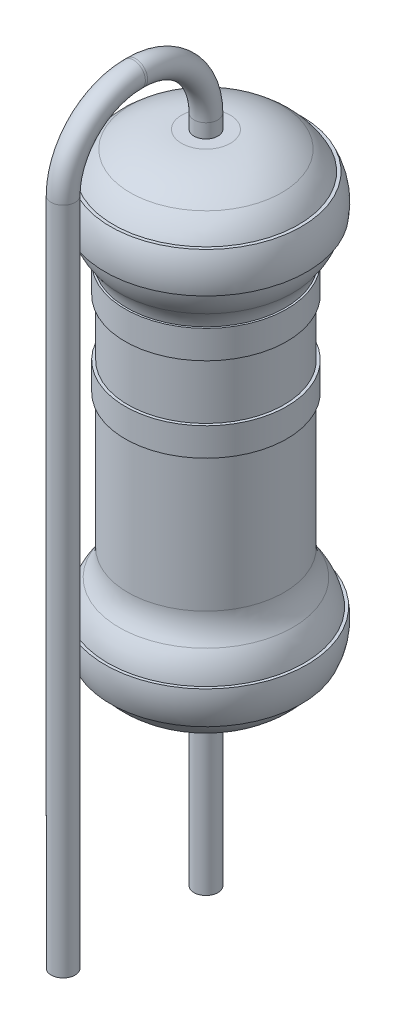
ISO-10303-21;
HEADER;
FILE_DESCRIPTION(('STEP AP214'),'2;1');
FILE_NAME('part.step','',(''),(''),'','','');
FILE_SCHEMA(('AUTOMOTIVE_DESIGN { 1 0 10303 214 1 1 1 1 }'));
ENDSEC;
DATA;
#1=APPLICATION_CONTEXT('core data for automotive mechanical design processes');
#2=APPLICATION_PROTOCOL_DEFINITION('international standard','automotive_design',2000,#1);
#3=PRODUCT_CONTEXT('',#1,'mechanical');
#4=PRODUCT('Part','Part','',(#3));
#5=PRODUCT_RELATED_PRODUCT_CATEGORY('part','',(#4));
#6=PRODUCT_DEFINITION_FORMATION('','',#4);
#7=PRODUCT_DEFINITION_CONTEXT('part definition',#1,'design');
#8=PRODUCT_DEFINITION('design','',#6,#7);
#9=PRODUCT_DEFINITION_SHAPE('','',#8);
#10=(LENGTH_UNIT() NAMED_UNIT(*) SI_UNIT(.MILLI.,.METRE.));
#11=(NAMED_UNIT(*) PLANE_ANGLE_UNIT() SI_UNIT($,.RADIAN.));
#12=(NAMED_UNIT(*) SI_UNIT($,.STERADIAN.) SOLID_ANGLE_UNIT());
#13=UNCERTAINTY_MEASURE_WITH_UNIT(LENGTH_MEASURE(1.E-05),#10,'distance_accuracy_value','');
#14=(GEOMETRIC_REPRESENTATION_CONTEXT(3) GLOBAL_UNCERTAINTY_ASSIGNED_CONTEXT((#13)) GLOBAL_UNIT_ASSIGNED_CONTEXT((#10,
#11,#12)) REPRESENTATION_CONTEXT('',''));
#15=CARTESIAN_POINT('',(0.,0.,0.));
#16=DIRECTION('',(0.,0.,1.));
#17=DIRECTION('',(1.,0.,0.));
#18=AXIS2_PLACEMENT_3D('',#15,#16,#17);
#19=CARTESIAN_POINT('',(0.,6.40354127879501,0.));
#20=DIRECTION('',(0.,-1.,0.));
#21=DIRECTION('',(0.,0.,-1.));
#22=AXIS2_PLACEMENT_3D('',#19,#20,#21);
#23=DEGENERATE_TOROIDAL_SURFACE('',#22,1.47300986247745,2.04567368369558,.T.);
#24=CARTESIAN_POINT('',(0.,7.35,0.));
#25=DIRECTION('',(0.,-1.,0.));
#26=DIRECTION('',(0.,0.,-1.));
#27=AXIS2_PLACEMENT_3D('',#24,#25,#26);
#28=CIRCLE('',#27,3.28656899005495);
#29=CARTESIAN_POINT('',(0.,7.35,-3.28656899005495));
#30=VERTEX_POINT('',#29);
#31=EDGE_CURVE('E156',#30,#30,#28,.T.);
#32=ORIENTED_EDGE('',*,*,#31,.F.);
#33=EDGE_LOOP('',(#32));
#34=FACE_BOUND('',#33,.T.);
#35=CARTESIAN_POINT('',(0.,8.04349462526248,0.));
#36=DIRECTION('',(0.,-1.,0.));
#37=DIRECTION('',(0.,0.,-1.));
#38=AXIS2_PLACEMENT_3D('',#35,#36,#37);
#39=CIRCLE('',#38,2.69584829889283);
#40=CARTESIAN_POINT('',(0.,8.04349462526248,-2.69584829889283));
#41=VERTEX_POINT('',#40);
#42=EDGE_CURVE('E67',#41,#41,#39,.T.);
#43=ORIENTED_EDGE('',*,*,#42,.T.);
#44=EDGE_LOOP('',(#43));
#45=FACE_BOUND('',#44,.T.);
#46=ADVANCED_FACE('F53',(#34,#45),#23,.T.);
#47=CARTESIAN_POINT('',(0.,5.59195244784367,0.));
#48=DIRECTION('',(0.,-1.,0.));
#49=DIRECTION('',(0.,0.,-1.));
#50=AXIS2_PLACEMENT_3D('',#47,#48,#49);
#51=DEGENERATE_TOROIDAL_SURFACE('',#50,0.867845075814161,3.05804755215633,.T.);
#52=ORIENTED_EDGE('',*,*,#42,.F.);
#53=EDGE_LOOP('',(#52));
#54=FACE_BOUND('',#53,.T.);
#55=CARTESIAN_POINT('',(0.,8.65,0.));
#56=DIRECTION('',(0.,-1.,0.));
#57=DIRECTION('',(0.,0.,-1.));
#58=AXIS2_PLACEMENT_3D('',#55,#56,#57);
#59=CIRCLE('',#58,0.867845075814162);
#60=CARTESIAN_POINT('',(0.,8.65,-0.867845075814162));
#61=VERTEX_POINT('',#60);
#62=EDGE_CURVE('E74',#61,#61,#59,.T.);
#63=ORIENTED_EDGE('',*,*,#62,.T.);
#64=EDGE_LOOP('',(#63));
#65=FACE_BOUND('',#64,.T.);
#66=ADVANCED_FACE('F202',(#54,#65),#51,.T.);
#67=CARTESIAN_POINT('',(0.,8.65,0.867845075814161));
#68=DIRECTION('',(0.,-1.,0.));
#69=DIRECTION('',(0.,0.,-1.));
#70=AXIS2_PLACEMENT_3D('',#67,#68,#69);
#71=PLANE('',#70);
#72=CARTESIAN_POINT('',(0.,8.65,0.));
#73=DIRECTION('',(0.,-1.,0.));
#74=DIRECTION('',(0.,0.,-1.));
#75=AXIS2_PLACEMENT_3D('',#72,#73,#74);
#76=CIRCLE('',#75,0.425);
#77=CARTESIAN_POINT('',(0.,8.65,-0.425000000000002));
#78=VERTEX_POINT('',#77);
#79=EDGE_CURVE('E11',#78,#78,#76,.F.);
#80=ORIENTED_EDGE('',*,*,#79,.F.);
#81=EDGE_LOOP('',(#80));
#82=FACE_BOUND('',#81,.T.);
#83=ORIENTED_EDGE('',*,*,#62,.F.);
#84=EDGE_LOOP('',(#83));
#85=FACE_BOUND('',#84,.T.);
#86=ADVANCED_FACE('F207',(#82,#85),#71,.F.);
#87=CARTESIAN_POINT('',(0.,-8.65,0.867845075814161));
#88=DIRECTION('',(0.,1.,0.));
#89=DIRECTION('',(0.,0.,1.));
#90=AXIS2_PLACEMENT_3D('',#87,#88,#89);
#91=PLANE('',#90);
#92=CARTESIAN_POINT('',(0.,-8.65,0.));
#93=DIRECTION('',(0.,1.,0.));
#94=DIRECTION('',(0.,0.,1.));
#95=AXIS2_PLACEMENT_3D('',#92,#93,#94);
#96=CIRCLE('',#95,0.425);
#97=CARTESIAN_POINT('',(0.,-8.65,0.424999999999999));
#98=VERTEX_POINT('',#97);
#99=EDGE_CURVE('E60',#98,#98,#96,.F.);
#100=ORIENTED_EDGE('',*,*,#99,.F.);
#101=EDGE_LOOP('',(#100));
#102=FACE_BOUND('',#101,.T.);
#103=CARTESIAN_POINT('',(0.,-8.65,0.));
#104=DIRECTION('',(0.,-1.,0.));
#105=DIRECTION('',(0.,0.,-1.));
#106=AXIS2_PLACEMENT_3D('',#103,#104,#105);
#107=CIRCLE('',#106,0.867845075814161);
#108=CARTESIAN_POINT('',(0.,-8.65,-0.867845075814161));
#109=VERTEX_POINT('',#108);
#110=EDGE_CURVE('E79',#109,#109,#107,.T.);
#111=ORIENTED_EDGE('',*,*,#110,.T.);
#112=EDGE_LOOP('',(#111));
#113=FACE_BOUND('',#112,.T.);
#114=ADVANCED_FACE('F216',(#102,#113),#91,.F.);
#115=CARTESIAN_POINT('',(0.,-5.59195244784367,0.));
#116=DIRECTION('',(0.,-1.,0.));
#117=DIRECTION('',(0.,0.,-1.));
#118=AXIS2_PLACEMENT_3D('',#115,#116,#117);
#119=DEGENERATE_TOROIDAL_SURFACE('',#118,0.867845075814161,3.05804755215633,.T.);
#120=ORIENTED_EDGE('',*,*,#110,.F.);
#121=EDGE_LOOP('',(#120));
#122=FACE_BOUND('',#121,.T.);
#123=CARTESIAN_POINT('',(0.,-8.04349462526247,0.));
#124=DIRECTION('',(0.,-1.,0.));
#125=DIRECTION('',(0.,0.,-1.));
#126=AXIS2_PLACEMENT_3D('',#123,#124,#125);
#127=CIRCLE('',#126,2.69584829889283);
#128=CARTESIAN_POINT('',(0.,-8.04349462526247,-2.69584829889283));
#129=VERTEX_POINT('',#128);
#130=EDGE_CURVE('E83',#129,#129,#127,.T.);
#131=ORIENTED_EDGE('',*,*,#130,.T.);
#132=EDGE_LOOP('',(#131));
#133=FACE_BOUND('',#132,.T.);
#134=ADVANCED_FACE('F222',(#122,#133),#119,.T.);
#135=CARTESIAN_POINT('',(0.,-6.40354127879501,0.));
#136=DIRECTION('',(0.,-1.,0.));
#137=DIRECTION('',(0.,0.,-1.));
#138=AXIS2_PLACEMENT_3D('',#135,#136,#137);
#139=DEGENERATE_TOROIDAL_SURFACE('',#138,1.47300986247745,2.04567368369558,.T.);
#140=ORIENTED_EDGE('',*,*,#130,.F.);
#141=EDGE_LOOP('',(#140));
#142=FACE_BOUND('',#141,.T.);
#143=CARTESIAN_POINT('',(0.,-7.35,0.));
#144=DIRECTION('',(0.,-1.,0.));
#145=DIRECTION('',(0.,0.,-1.));
#146=AXIS2_PLACEMENT_3D('',#143,#144,#145);
#147=CIRCLE('',#146,3.28656899005495);
#148=CARTESIAN_POINT('',(0.,-7.35,-3.28656899005495));
#149=VERTEX_POINT('',#148);
#150=EDGE_CURVE('E86',#149,#149,#147,.T.);
#151=ORIENTED_EDGE('',*,*,#150,.T.);
#152=EDGE_LOOP('',(#151));
#153=FACE_BOUND('',#152,.T.);
#154=ADVANCED_FACE('F228',(#142,#153),#139,.T.);
#155=CARTESIAN_POINT('',(0.,-7.35,3.28656899005495));
#156=DIRECTION('',(0.,1.,0.));
#157=DIRECTION('',(0.,0.,1.));
#158=AXIS2_PLACEMENT_3D('',#155,#156,#157);
#159=PLANE('',#158);
#160=ORIENTED_EDGE('',*,*,#150,.F.);
#161=EDGE_LOOP('',(#160));
#162=FACE_BOUND('',#161,.T.);
#163=CARTESIAN_POINT('',(0.,-7.35,0.));
#164=DIRECTION('',(0.,-1.,0.));
#165=DIRECTION('',(0.,0.,-1.));
#166=AXIS2_PLACEMENT_3D('',#163,#164,#165);
#167=CIRCLE('',#166,3.39866077735241);
#168=CARTESIAN_POINT('',(0.,-7.35,-3.39866077735241));
#169=VERTEX_POINT('',#168);
#170=EDGE_CURVE('E90',#169,#169,#167,.T.);
#171=ORIENTED_EDGE('',*,*,#170,.T.);
#172=EDGE_LOOP('',(#171));
#173=FACE_BOUND('',#172,.T.);
#174=ADVANCED_FACE('F232',(#162,#173),#159,.F.);
#175=CARTESIAN_POINT('',(0.,-6.40354127879501,0.));
#176=DIRECTION('',(0.,-1.,0.));
#177=DIRECTION('',(0.,0.,-1.));
#178=AXIS2_PLACEMENT_3D('',#175,#176,#177);
#179=DEGENERATE_TOROIDAL_SURFACE('',#178,1.47300986247745,2.14567368369557,.T.);
#180=ORIENTED_EDGE('',*,*,#170,.F.);
#181=EDGE_LOOP('',(#180));
#182=FACE_BOUND('',#181,.T.);
#183=CARTESIAN_POINT('',(0.,-6.05,0.));
#184=DIRECTION('',(0.,-1.,0.));
#185=DIRECTION('',(0.,0.,-1.));
#186=AXIS2_PLACEMENT_3D('',#183,#184,#185);
#187=CIRCLE('',#186,3.58935674356564);
#188=CARTESIAN_POINT('',(0.,-6.05,-3.58935674356564));
#189=VERTEX_POINT('',#188);
#190=EDGE_CURVE('E94',#189,#189,#187,.T.);
#191=ORIENTED_EDGE('',*,*,#190,.T.);
#192=EDGE_LOOP('',(#191));
#193=FACE_BOUND('',#192,.T.);
#194=ADVANCED_FACE('F236',(#182,#193),#179,.T.);
#195=CARTESIAN_POINT('',(0.,-6.05,3.48790176636525));
#196=DIRECTION('',(0.,-1.,0.));
#197=DIRECTION('',(0.,0.,-1.));
#198=AXIS2_PLACEMENT_3D('',#195,#196,#197);
#199=PLANE('',#198);
#200=ORIENTED_EDGE('',*,*,#190,.F.);
#201=EDGE_LOOP('',(#200));
#202=FACE_BOUND('',#201,.T.);
#203=CARTESIAN_POINT('',(0.,-6.05,0.));
#204=DIRECTION('',(0.,-1.,0.));
#205=DIRECTION('',(0.,0.,-1.));
#206=AXIS2_PLACEMENT_3D('',#203,#204,#205);
#207=CIRCLE('',#206,3.48790176636525);
#208=CARTESIAN_POINT('',(0.,-6.05,-3.48790176636525));
#209=VERTEX_POINT('',#208);
#210=EDGE_CURVE('E98',#209,#209,#207,.T.);
#211=ORIENTED_EDGE('',*,*,#210,.T.);
#212=EDGE_LOOP('',(#211));
#213=FACE_BOUND('',#212,.T.);
#214=ADVANCED_FACE('F240',(#202,#213),#199,.F.);
#215=CARTESIAN_POINT('',(0.,-6.40354127879501,0.));
#216=DIRECTION('',(0.,-1.,0.));
#217=DIRECTION('',(0.,0.,-1.));
#218=AXIS2_PLACEMENT_3D('',#215,#216,#217);
#219=DEGENERATE_TOROIDAL_SURFACE('',#218,1.47300986247745,2.04567368369558,.T.);
#220=ORIENTED_EDGE('',*,*,#210,.F.);
#221=EDGE_LOOP('',(#220));
#222=FACE_BOUND('',#221,.T.);
#223=CARTESIAN_POINT('',(0.,-5.15,0.));
#224=DIRECTION('',(0.,-1.,0.));
#225=DIRECTION('',(0.,0.,-1.));
#226=AXIS2_PLACEMENT_3D('',#223,#224,#225);
#227=CIRCLE('',#226,3.08961590060844);
#228=CARTESIAN_POINT('',(0.,-5.15,-3.08961590060844));
#229=VERTEX_POINT('',#228);
#230=EDGE_CURVE('E102',#229,#229,#227,.T.);
#231=ORIENTED_EDGE('',*,*,#230,.T.);
#232=EDGE_LOOP('',(#231));
#233=FACE_BOUND('',#232,.T.);
#234=ADVANCED_FACE('F244',(#222,#233),#219,.T.);
#235=CARTESIAN_POINT('',(0.,-4.23083486961827,0.));
#236=DIRECTION('',(0.,-1.,0.));
#237=DIRECTION('',(0.,0.,-1.));
#238=AXIS2_PLACEMENT_3D('',#235,#236,#237);
#239=TOROIDAL_SURFACE('',#238,4.275,1.5);
#240=ORIENTED_EDGE('',*,*,#230,.F.);
#241=EDGE_LOOP('',(#240));
#242=FACE_BOUND('',#241,.T.);
#243=CARTESIAN_POINT('',(0.,-4.23083486961827,0.));
#244=DIRECTION('',(0.,-1.,0.));
#245=DIRECTION('',(0.,0.,-1.));
#246=AXIS2_PLACEMENT_3D('',#243,#244,#245);
#247=CIRCLE('',#246,2.775);
#248=CARTESIAN_POINT('',(0.,-4.23083486961827,-2.775));
#249=VERTEX_POINT('',#248);
#250=EDGE_CURVE('E106',#249,#249,#247,.T.);
#251=ORIENTED_EDGE('',*,*,#250,.T.);
#252=EDGE_LOOP('',(#251));
#253=FACE_BOUND('',#252,.T.);
#254=ADVANCED_FACE('F248',(#242,#253),#239,.F.);
#255=CARTESIAN_POINT('',(0.,-8.65,0.));
#256=DIRECTION('',(0.,-1.,0.));
#257=DIRECTION('',(0.,0.,-1.));
#258=AXIS2_PLACEMENT_3D('',#255,#256,#257);
#259=CYLINDRICAL_SURFACE('',#258,2.775);
#260=ORIENTED_EDGE('',*,*,#250,.F.);
#261=EDGE_LOOP('',(#260));
#262=FACE_BOUND('',#261,.T.);
#263=CARTESIAN_POINT('',(0.,0.549999999999997,0.));
#264=DIRECTION('',(0.,-1.,0.));
#265=DIRECTION('',(0.,0.,-1.));
#266=AXIS2_PLACEMENT_3D('',#263,#264,#265);
#267=CIRCLE('',#266,2.775);
#268=CARTESIAN_POINT('',(0.,0.549999999999997,-2.775));
#269=VERTEX_POINT('',#268);
#270=EDGE_CURVE('E109',#269,#269,#267,.T.);
#271=ORIENTED_EDGE('',*,*,#270,.T.);
#272=EDGE_LOOP('',(#271));
#273=FACE_BOUND('',#272,.T.);
#274=ADVANCED_FACE('F252',(#262,#273),#259,.T.);
#275=CARTESIAN_POINT('',(0.,0.549999999999998,2.875));
#276=DIRECTION('',(0.,1.,0.));
#277=DIRECTION('',(0.,0.,1.));
#278=AXIS2_PLACEMENT_3D('',#275,#276,#277);
#279=PLANE('',#278);
#280=ORIENTED_EDGE('',*,*,#270,.F.);
#281=EDGE_LOOP('',(#280));
#282=FACE_BOUND('',#281,.T.);
#283=CARTESIAN_POINT('',(0.,0.549999999999998,0.));
#284=DIRECTION('',(0.,-1.,0.));
#285=DIRECTION('',(0.,0.,-1.));
#286=AXIS2_PLACEMENT_3D('',#283,#284,#285);
#287=CIRCLE('',#286,2.875);
#288=CARTESIAN_POINT('',(0.,0.549999999999998,-2.875));
#289=VERTEX_POINT('',#288);
#290=EDGE_CURVE('E113',#289,#289,#287,.T.);
#291=ORIENTED_EDGE('',*,*,#290,.T.);
#292=EDGE_LOOP('',(#291));
#293=FACE_BOUND('',#292,.T.);
#294=ADVANCED_FACE('F256',(#282,#293),#279,.F.);
#295=CARTESIAN_POINT('',(0.,-8.65,0.));
#296=DIRECTION('',(0.,-1.,0.));
#297=DIRECTION('',(0.,0.,-1.));
#298=AXIS2_PLACEMENT_3D('',#295,#296,#297);
#299=CYLINDRICAL_SURFACE('',#298,2.875);
#300=ORIENTED_EDGE('',*,*,#290,.F.);
#301=EDGE_LOOP('',(#300));
#302=FACE_BOUND('',#301,.T.);
#303=CARTESIAN_POINT('',(0.,1.55,0.));
#304=DIRECTION('',(0.,-1.,0.));
#305=DIRECTION('',(0.,0.,-1.));
#306=AXIS2_PLACEMENT_3D('',#303,#304,#305);
#307=CIRCLE('',#306,2.875);
#308=CARTESIAN_POINT('',(0.,1.55,-2.875));
#309=VERTEX_POINT('',#308);
#310=EDGE_CURVE('E117',#309,#309,#307,.T.);
#311=ORIENTED_EDGE('',*,*,#310,.T.);
#312=EDGE_LOOP('',(#311));
#313=FACE_BOUND('',#312,.T.);
#314=ADVANCED_FACE('F260',(#302,#313),#299,.T.);
#315=CARTESIAN_POINT('',(0.,1.55,2.875));
#316=DIRECTION('',(0.,-1.,0.));
#317=DIRECTION('',(0.,0.,-1.));
#318=AXIS2_PLACEMENT_3D('',#315,#316,#317);
#319=PLANE('',#318);
#320=ORIENTED_EDGE('',*,*,#310,.F.);
#321=EDGE_LOOP('',(#320));
#322=FACE_BOUND('',#321,.T.);
#323=CARTESIAN_POINT('',(0.,1.55,0.));
#324=DIRECTION('',(0.,-1.,0.));
#325=DIRECTION('',(0.,0.,-1.));
#326=AXIS2_PLACEMENT_3D('',#323,#324,#325);
#327=CIRCLE('',#326,2.775);
#328=CARTESIAN_POINT('',(0.,1.55,-2.775));
#329=VERTEX_POINT('',#328);
#330=EDGE_CURVE('E121',#329,#329,#327,.T.);
#331=ORIENTED_EDGE('',*,*,#330,.T.);
#332=EDGE_LOOP('',(#331));
#333=FACE_BOUND('',#332,.T.);
#334=ADVANCED_FACE('F264',(#322,#333),#319,.F.);
#335=CARTESIAN_POINT('',(0.,-8.65,0.));
#336=DIRECTION('',(0.,-1.,0.));
#337=DIRECTION('',(0.,0.,-1.));
#338=AXIS2_PLACEMENT_3D('',#335,#336,#337);
#339=CYLINDRICAL_SURFACE('',#338,2.775);
#340=ORIENTED_EDGE('',*,*,#330,.F.);
#341=EDGE_LOOP('',(#340));
#342=FACE_BOUND('',#341,.T.);
#343=CARTESIAN_POINT('',(0.,3.55,0.));
#344=DIRECTION('',(0.,-1.,0.));
#345=DIRECTION('',(0.,0.,-1.));
#346=AXIS2_PLACEMENT_3D('',#343,#344,#345);
#347=CIRCLE('',#346,2.775);
#348=CARTESIAN_POINT('',(0.,3.55,-2.775));
#349=VERTEX_POINT('',#348);
#350=EDGE_CURVE('E125',#349,#349,#347,.T.);
#351=ORIENTED_EDGE('',*,*,#350,.T.);
#352=EDGE_LOOP('',(#351));
#353=FACE_BOUND('',#352,.T.);
#354=ADVANCED_FACE('F268',(#342,#353),#339,.T.);
#355=CARTESIAN_POINT('',(0.,3.55,2.875));
#356=DIRECTION('',(0.,1.,0.));
#357=DIRECTION('',(0.,0.,1.));
#358=AXIS2_PLACEMENT_3D('',#355,#356,#357);
#359=PLANE('',#358);
#360=ORIENTED_EDGE('',*,*,#350,.F.);
#361=EDGE_LOOP('',(#360));
#362=FACE_BOUND('',#361,.T.);
#363=CARTESIAN_POINT('',(0.,3.55,0.));
#364=DIRECTION('',(0.,-1.,0.));
#365=DIRECTION('',(0.,0.,-1.));
#366=AXIS2_PLACEMENT_3D('',#363,#364,#365);
#367=CIRCLE('',#366,2.875);
#368=CARTESIAN_POINT('',(0.,3.55,-2.875));
#369=VERTEX_POINT('',#368);
#370=EDGE_CURVE('E129',#369,#369,#367,.T.);
#371=ORIENTED_EDGE('',*,*,#370,.T.);
#372=EDGE_LOOP('',(#371));
#373=FACE_BOUND('',#372,.T.);
#374=ADVANCED_FACE('F272',(#362,#373),#359,.F.);
#375=CARTESIAN_POINT('',(0.,-8.65,0.));
#376=DIRECTION('',(0.,-1.,0.));
#377=DIRECTION('',(0.,0.,-1.));
#378=AXIS2_PLACEMENT_3D('',#375,#376,#377);
#379=CYLINDRICAL_SURFACE('',#378,2.875);
#380=ORIENTED_EDGE('',*,*,#370,.F.);
#381=EDGE_LOOP('',(#380));
#382=FACE_BOUND('',#381,.T.);
#383=CARTESIAN_POINT('',(0.,4.55,0.));
#384=DIRECTION('',(0.,-1.,0.));
#385=DIRECTION('',(0.,0.,-1.));
#386=AXIS2_PLACEMENT_3D('',#383,#384,#385);
#387=CIRCLE('',#386,2.875);
#388=CARTESIAN_POINT('',(0.,4.55,-2.875));
#389=VERTEX_POINT('',#388);
#390=EDGE_CURVE('E133',#389,#389,#387,.T.);
#391=ORIENTED_EDGE('',*,*,#390,.T.);
#392=EDGE_LOOP('',(#391));
#393=FACE_BOUND('',#392,.T.);
#394=ADVANCED_FACE('F276',(#382,#393),#379,.T.);
#395=CARTESIAN_POINT('',(0.,4.55,2.875));
#396=DIRECTION('',(0.,-1.,0.));
#397=DIRECTION('',(0.,0.,-1.));
#398=AXIS2_PLACEMENT_3D('',#395,#396,#397);
#399=PLANE('',#398);
#400=ORIENTED_EDGE('',*,*,#390,.F.);
#401=EDGE_LOOP('',(#400));
#402=FACE_BOUND('',#401,.T.);
#403=CARTESIAN_POINT('',(0.,4.55,0.));
#404=DIRECTION('',(0.,-1.,0.));
#405=DIRECTION('',(0.,0.,-1.));
#406=AXIS2_PLACEMENT_3D('',#403,#404,#405);
#407=CIRCLE('',#406,2.80934873876887);
#408=CARTESIAN_POINT('',(0.,4.55,-2.80934873876887));
#409=VERTEX_POINT('',#408);
#410=EDGE_CURVE('E137',#409,#409,#407,.T.);
#411=ORIENTED_EDGE('',*,*,#410,.T.);
#412=EDGE_LOOP('',(#411));
#413=FACE_BOUND('',#412,.T.);
#414=ADVANCED_FACE('F280',(#402,#413),#399,.F.);
#415=CARTESIAN_POINT('',(0.,4.23083486961827,0.));
#416=DIRECTION('',(0.,-1.,0.));
#417=DIRECTION('',(0.,0.,-1.));
#418=AXIS2_PLACEMENT_3D('',#415,#416,#417);
#419=TOROIDAL_SURFACE('',#418,4.275,1.5);
#420=ORIENTED_EDGE('',*,*,#410,.F.);
#421=EDGE_LOOP('',(#420));
#422=FACE_BOUND('',#421,.T.);
#423=CARTESIAN_POINT('',(0.,5.15,0.));
#424=DIRECTION('',(0.,-1.,0.));
#425=DIRECTION('',(0.,0.,-1.));
#426=AXIS2_PLACEMENT_3D('',#423,#424,#425);
#427=CIRCLE('',#426,3.08961590060844);
#428=CARTESIAN_POINT('',(0.,5.15,-3.08961590060844));
#429=VERTEX_POINT('',#428);
#430=EDGE_CURVE('E141',#429,#429,#427,.T.);
#431=ORIENTED_EDGE('',*,*,#430,.T.);
#432=EDGE_LOOP('',(#431));
#433=FACE_BOUND('',#432,.T.);
#434=ADVANCED_FACE('F284',(#422,#433),#419,.F.);
#435=CARTESIAN_POINT('',(0.,6.40354127879501,0.));
#436=DIRECTION('',(0.,-1.,0.));
#437=DIRECTION('',(0.,0.,-1.));
#438=AXIS2_PLACEMENT_3D('',#435,#436,#437);
#439=DEGENERATE_TOROIDAL_SURFACE('',#438,1.47300986247745,2.04567368369558,.T.);
#440=ORIENTED_EDGE('',*,*,#430,.F.);
#441=EDGE_LOOP('',(#440));
#442=FACE_BOUND('',#441,.T.);
#443=CARTESIAN_POINT('',(0.,6.05,0.));
#444=DIRECTION('',(0.,-1.,0.));
#445=DIRECTION('',(0.,0.,-1.));
#446=AXIS2_PLACEMENT_3D('',#443,#444,#445);
#447=CIRCLE('',#446,3.48790176636525);
#448=CARTESIAN_POINT('',(0.,6.05,-3.48790176636525));
#449=VERTEX_POINT('',#448);
#450=EDGE_CURVE('E145',#449,#449,#447,.T.);
#451=ORIENTED_EDGE('',*,*,#450,.T.);
#452=EDGE_LOOP('',(#451));
#453=FACE_BOUND('',#452,.T.);
#454=ADVANCED_FACE('F288',(#442,#453),#439,.T.);
#455=CARTESIAN_POINT('',(0.,6.05,3.48790176636525));
#456=DIRECTION('',(0.,1.,0.));
#457=DIRECTION('',(0.,0.,1.));
#458=AXIS2_PLACEMENT_3D('',#455,#456,#457);
#459=PLANE('',#458);
#460=ORIENTED_EDGE('',*,*,#450,.F.);
#461=EDGE_LOOP('',(#460));
#462=FACE_BOUND('',#461,.T.);
#463=CARTESIAN_POINT('',(0.,6.05,0.));
#464=DIRECTION('',(0.,-1.,0.));
#465=DIRECTION('',(0.,0.,-1.));
#466=AXIS2_PLACEMENT_3D('',#463,#464,#465);
#467=CIRCLE('',#466,3.58935674356564);
#468=CARTESIAN_POINT('',(0.,6.05,-3.58935674356564));
#469=VERTEX_POINT('',#468);
#470=EDGE_CURVE('E148',#469,#469,#467,.T.);
#471=ORIENTED_EDGE('',*,*,#470,.T.);
#472=EDGE_LOOP('',(#471));
#473=FACE_BOUND('',#472,.T.);
#474=ADVANCED_FACE('F292',(#462,#473),#459,.F.);
#475=CARTESIAN_POINT('',(0.,6.40354127879501,0.));
#476=DIRECTION('',(0.,-1.,0.));
#477=DIRECTION('',(0.,0.,-1.));
#478=AXIS2_PLACEMENT_3D('',#475,#476,#477);
#479=DEGENERATE_TOROIDAL_SURFACE('',#478,1.47300986247745,2.14567368369557,.T.);
#480=ORIENTED_EDGE('',*,*,#470,.F.);
#481=EDGE_LOOP('',(#480));
#482=FACE_BOUND('',#481,.T.);
#483=CARTESIAN_POINT('',(0.,7.35,0.));
#484=DIRECTION('',(0.,-1.,0.));
#485=DIRECTION('',(0.,0.,-1.));
#486=AXIS2_PLACEMENT_3D('',#483,#484,#485);
#487=CIRCLE('',#486,3.39866077735241);
#488=CARTESIAN_POINT('',(0.,7.35,-3.39866077735241));
#489=VERTEX_POINT('',#488);
#490=EDGE_CURVE('E152',#489,#489,#487,.T.);
#491=ORIENTED_EDGE('',*,*,#490,.T.);
#492=EDGE_LOOP('',(#491));
#493=FACE_BOUND('',#492,.T.);
#494=ADVANCED_FACE('F296',(#482,#493),#479,.T.);
#495=CARTESIAN_POINT('',(0.,7.35,3.28656899005495));
#496=DIRECTION('',(0.,-1.,0.));
#497=DIRECTION('',(0.,0.,-1.));
#498=AXIS2_PLACEMENT_3D('',#495,#496,#497);
#499=PLANE('',#498);
#500=ORIENTED_EDGE('',*,*,#490,.F.);
#501=EDGE_LOOP('',(#500));
#502=FACE_BOUND('',#501,.T.);
#503=ORIENTED_EDGE('',*,*,#31,.T.);
#504=EDGE_LOOP('',(#503));
#505=FACE_BOUND('',#504,.T.);
#506=ADVANCED_FACE('F300',(#502,#505),#499,.F.);
#507=CARTESIAN_POINT('',(0.,-14.65,0.));
#508=DIRECTION('',(0.,1.,0.));
#509=DIRECTION('',(0.,0.,1.));
#510=AXIS2_PLACEMENT_3D('',#507,#508,#509);
#511=PLANE('',#510);
#512=CARTESIAN_POINT('',(0.,-14.65,0.));
#513=DIRECTION('',(0.,1.,0.));
#514=DIRECTION('',(0.,0.,1.));
#515=AXIS2_PLACEMENT_3D('',#512,#513,#514);
#516=CIRCLE('',#515,0.425);
#517=CARTESIAN_POINT('',(0.,-14.65,0.424999999999998));
#518=VERTEX_POINT('',#517);
#519=EDGE_CURVE('E160',#518,#518,#516,.T.);
#520=ORIENTED_EDGE('',*,*,#519,.F.);
#521=EDGE_LOOP('',(#520));
#522=FACE_BOUND('',#521,.T.);
#523=ADVANCED_FACE('F303',(#522),#511,.F.);
#524=CARTESIAN_POINT('',(0.,0.,0.));
#525=DIRECTION('',(0.,-1.,0.));
#526=DIRECTION('',(0.,0.,-1.));
#527=AXIS2_PLACEMENT_3D('',#524,#525,#526);
#528=CYLINDRICAL_SURFACE('',#527,0.425);
#529=ORIENTED_EDGE('',*,*,#519,.T.);
#530=EDGE_LOOP('',(#529));
#531=FACE_BOUND('',#530,.T.);
#532=ORIENTED_EDGE('',*,*,#99,.T.);
#533=EDGE_LOOP('',(#532));
#534=FACE_BOUND('',#533,.T.);
#535=ADVANCED_FACE('F308',(#531,#534),#528,.T.);
#536=CARTESIAN_POINT('',(0.,9.14999999999998,0.));
#537=DIRECTION('',(0.,-1.,0.));
#538=DIRECTION('',(0.,0.,-1.));
#539=AXIS2_PLACEMENT_3D('',#536,#537,#538);
#540=CYLINDRICAL_SURFACE('',#539,0.425);
#541=CARTESIAN_POINT('',(0.,9.14999999999998,-1.13180701953222E-13));
#542=DIRECTION('',(0.,1.,0.));
#543=DIRECTION('',(0.,0.,1.));
#544=AXIS2_PLACEMENT_3D('',#541,#542,#543);
#545=CIRCLE('',#544,0.425);
#546=CARTESIAN_POINT('',(0.,9.14999999999998,-0.424999999999999));
#547=VERTEX_POINT('',#546);
#548=EDGE_CURVE('E164',#547,#547,#545,.T.);
#549=ORIENTED_EDGE('',*,*,#548,.F.);
#550=EDGE_LOOP('',(#549));
#551=FACE_BOUND('',#550,.T.);
#552=ORIENTED_EDGE('',*,*,#79,.T.);
#553=EDGE_LOOP('',(#552));
#554=FACE_BOUND('',#553,.T.);
#555=ADVANCED_FACE('F199',(#551,#554),#540,.T.);
#556=CARTESIAN_POINT('',(0.,-14.65,5.08));
#557=DIRECTION('',(0.,-1.,0.));
#558=DIRECTION('',(0.,0.,-1.));
#559=AXIS2_PLACEMENT_3D('',#556,#557,#558);
#560=PLANE('',#559);
#561=CARTESIAN_POINT('',(0.,-14.65,5.08));
#562=DIRECTION('',(0.,-1.,0.));
#563=DIRECTION('',(0.,0.,-1.));
#564=AXIS2_PLACEMENT_3D('',#561,#562,#563);
#565=CIRCLE('',#564,0.425);
#566=CARTESIAN_POINT('',(0.,-14.65,4.655));
#567=VERTEX_POINT('',#566);
#568=EDGE_CURVE('E180',#567,#567,#565,.T.);
#569=ORIENTED_EDGE('',*,*,#568,.T.);
#570=EDGE_LOOP('',(#569));
#571=FACE_BOUND('',#570,.T.);
#572=ADVANCED_FACE('F185',(#571),#560,.T.);
#573=CARTESIAN_POINT('',(0.,-14.65,5.08));
#574=DIRECTION('',(0.,1.,0.));
#575=DIRECTION('',(0.,0.,1.));
#576=AXIS2_PLACEMENT_3D('',#573,#574,#575);
#577=CYLINDRICAL_SURFACE('',#576,0.425);
#578=CARTESIAN_POINT('',(0.,9.14999999999998,5.08));
#579=DIRECTION('',(0.,-1.,0.));
#580=DIRECTION('',(0.,0.,-1.));
#581=AXIS2_PLACEMENT_3D('',#578,#579,#580);
#582=CIRCLE('',#581,0.425);
#583=CARTESIAN_POINT('',(0.,9.14999999999998,5.505));
#584=VERTEX_POINT('',#583);
#585=EDGE_CURVE('E176',#584,#584,#582,.T.);
#586=ORIENTED_EDGE('',*,*,#585,.T.);
#587=EDGE_LOOP('',(#586));
#588=FACE_BOUND('',#587,.T.);
#589=ORIENTED_EDGE('',*,*,#568,.F.);
#590=EDGE_LOOP('',(#589));
#591=FACE_BOUND('',#590,.T.);
#592=ADVANCED_FACE('F187',(#588,#591),#577,.T.);
#593=CARTESIAN_POINT('',(0.,9.15,2.58));
#594=DIRECTION('',(-1.,0.,0.));
#595=DIRECTION('',(0.,0.,1.));
#596=AXIS2_PLACEMENT_3D('',#593,#594,#595);
#597=TOROIDAL_SURFACE('',#596,2.5,0.425);
#598=CARTESIAN_POINT('',(0.,11.65,2.57999999999998));
#599=DIRECTION('',(0.,0.,1.));
#600=DIRECTION('',(0.,-1.,0.));
#601=AXIS2_PLACEMENT_3D('',#598,#599,#600);
#602=CIRCLE('',#601,0.425);
#603=CARTESIAN_POINT('',(0.,12.075,2.57999999999998));
#604=VERTEX_POINT('',#603);
#605=EDGE_CURVE('E172',#604,#604,#602,.T.);
#606=CARTESIAN_POINT('',(0.,9.15,2.58));
#607=DIRECTION('',(-1.,0.,0.));
#608=DIRECTION('',(0.,0.,1.));
#609=AXIS2_PLACEMENT_3D('',#606,#607,#608);
#610=CIRCLE('',#609,2.925);
#611=EDGE_CURVE('',#584,#604,#610,.T.);
#612=ORIENTED_EDGE('',*,*,#585,.F.);
#613=ORIENTED_EDGE('',*,*,#605,.T.);
#614=ORIENTED_EDGE('',*,*,#611,.T.);
#615=ORIENTED_EDGE('',*,*,#611,.F.);
#616=EDGE_LOOP('',(#612,#614,#613,#615));
#617=FACE_BOUND('',#616,.T.);
#618=ADVANCED_FACE('F189',(#617),#597,.T.);
#619=CARTESIAN_POINT('',(0.,11.65,2.57999999999998));
#620=DIRECTION('',(0.,0.,-1.));
#621=DIRECTION('',(-1.,0.,0.));
#622=AXIS2_PLACEMENT_3D('',#619,#620,#621);
#623=CYLINDRICAL_SURFACE('',#622,0.425);
#624=CARTESIAN_POINT('',(0.,11.65,2.50000000000002));
#625=DIRECTION('',(0.,0.,1.));
#626=DIRECTION('',(0.,-1.,0.));
#627=AXIS2_PLACEMENT_3D('',#624,#625,#626);
#628=CIRCLE('',#627,0.425);
#629=CARTESIAN_POINT('',(0.,12.075,2.50000000000002));
#630=VERTEX_POINT('',#629);
#631=EDGE_CURVE('E168',#630,#630,#628,.T.);
#632=ORIENTED_EDGE('',*,*,#631,.T.);
#633=EDGE_LOOP('',(#632));
#634=FACE_BOUND('',#633,.T.);
#635=ORIENTED_EDGE('',*,*,#605,.F.);
#636=EDGE_LOOP('',(#635));
#637=FACE_BOUND('',#636,.T.);
#638=ADVANCED_FACE('F196',(#634,#637),#623,.T.);
#639=CARTESIAN_POINT('',(0.,9.15,2.5));
#640=DIRECTION('',(-1.,0.,0.));
#641=DIRECTION('',(0.,0.,1.));
#642=AXIS2_PLACEMENT_3D('',#639,#640,#641);
#643=TOROIDAL_SURFACE('',#642,2.5,0.425);
#644=CARTESIAN_POINT('',(0.,9.15,2.5));
#645=DIRECTION('',(-1.,0.,0.));
#646=DIRECTION('',(0.,0.,1.));
#647=AXIS2_PLACEMENT_3D('',#644,#645,#646);
#648=CIRCLE('',#647,2.925);
#649=EDGE_CURVE('',#630,#547,#648,.T.);
#650=ORIENTED_EDGE('',*,*,#631,.F.);
#651=ORIENTED_EDGE('',*,*,#548,.T.);
#652=ORIENTED_EDGE('',*,*,#649,.T.);
#653=ORIENTED_EDGE('',*,*,#649,.F.);
#654=EDGE_LOOP('',(#650,#652,#651,#653));
#655=FACE_BOUND('',#654,.T.);
#656=ADVANCED_FACE('F316',(#655),#643,.T.);
#657=CLOSED_SHELL('',(#46,#66,#86,#114,#134,#154,#174,#194,#214,#234,#254,#274,#294,#314,#334,
#354,#374,#394,#414,#434,#454,#474,#494,#506,#523,#535,#555,#572,#592,#618,#638,#656));
#658=MANIFOLD_SOLID_BREP('B2',#657);
#659=ADVANCED_BREP_SHAPE_REPRESENTATION('',(#18,#658),#14);
#660=SHAPE_DEFINITION_REPRESENTATION(#9,#659);
ENDSEC;
END-ISO-10303-21;
